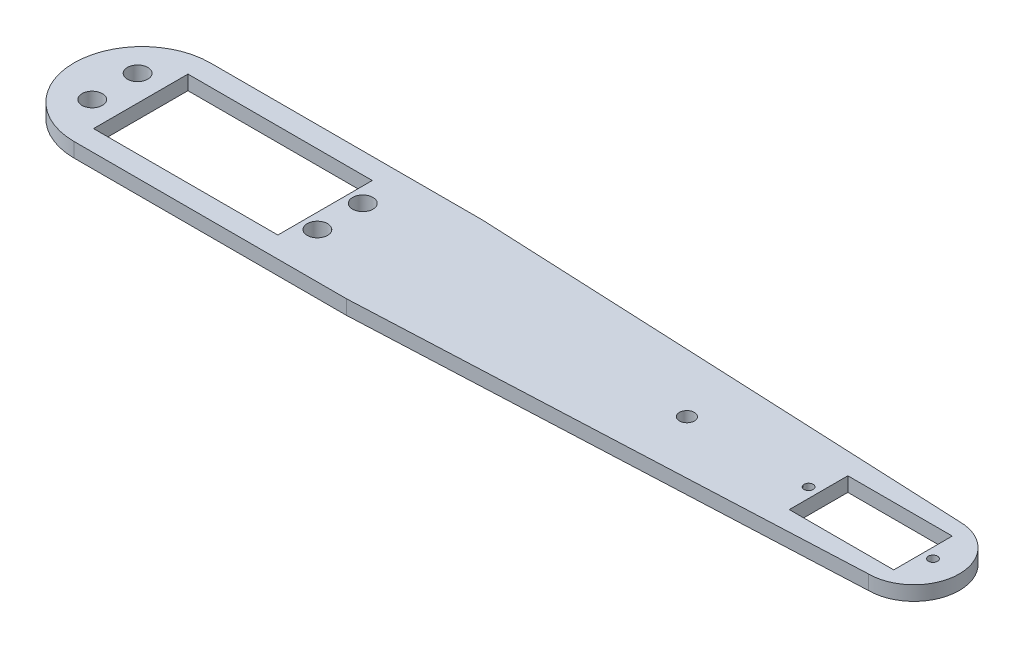
ISO-10303-21;
HEADER;
FILE_DESCRIPTION(('STEP AP214'),'2;1');
FILE_NAME('part.step','',(''),(''),'','','');
FILE_SCHEMA(('AUTOMOTIVE_DESIGN { 1 0 10303 214 1 1 1 1 }'));
ENDSEC;
DATA;
#1=APPLICATION_CONTEXT('core data for automotive mechanical design processes');
#2=APPLICATION_PROTOCOL_DEFINITION('international standard','automotive_design',2000,#1);
#3=PRODUCT_CONTEXT('',#1,'mechanical');
#4=PRODUCT('Part','Part','',(#3));
#5=PRODUCT_RELATED_PRODUCT_CATEGORY('part','',(#4));
#6=PRODUCT_DEFINITION_FORMATION('','',#4);
#7=PRODUCT_DEFINITION_CONTEXT('part definition',#1,'design');
#8=PRODUCT_DEFINITION('design','',#6,#7);
#9=PRODUCT_DEFINITION_SHAPE('','',#8);
#10=(LENGTH_UNIT() NAMED_UNIT(*) SI_UNIT(.MILLI.,.METRE.));
#11=(NAMED_UNIT(*) PLANE_ANGLE_UNIT() SI_UNIT($,.RADIAN.));
#12=(NAMED_UNIT(*) SI_UNIT($,.STERADIAN.) SOLID_ANGLE_UNIT());
#13=UNCERTAINTY_MEASURE_WITH_UNIT(LENGTH_MEASURE(1.E-05),#10,'distance_accuracy_value','');
#14=(GEOMETRIC_REPRESENTATION_CONTEXT(3) GLOBAL_UNCERTAINTY_ASSIGNED_CONTEXT((#13)) GLOBAL_UNIT_ASSIGNED_CONTEXT((#10,
#11,#12)) REPRESENTATION_CONTEXT('',''));
#15=CARTESIAN_POINT('',(0.,0.,0.));
#16=DIRECTION('',(0.,0.,1.));
#17=DIRECTION('',(1.,0.,0.));
#18=AXIS2_PLACEMENT_3D('',#15,#16,#17);
#19=CARTESIAN_POINT('',(-162.387355879804,3.175,-2.24465289077099));
#20=DIRECTION('',(0.,1.,0.));
#21=DIRECTION('',(0.,0.,1.));
#22=AXIS2_PLACEMENT_3D('',#19,#20,#21);
#23=PLANE('',#22);
#24=CARTESIAN_POINT('',(11.812644120196,3.175,-2.244652890771));
#25=DIRECTION('',(0.,1.,0.));
#26=DIRECTION('',(0.,0.,1.));
#27=AXIS2_PLACEMENT_3D('',#24,#25,#26);
#28=CIRCLE('',#27,1.);
#29=CARTESIAN_POINT('',(11.812644120196,3.175,-1.244652890771));
#30=VERTEX_POINT('',#29);
#31=EDGE_CURVE('E383',#30,#30,#28,.T.);
#32=ORIENTED_EDGE('',*,*,#31,.F.);
#33=EDGE_LOOP('',(#32));
#34=FACE_BOUND('',#33,.T.);
#35=DIRECTION('',(-1.,0.,0.));
#36=VECTOR('',#35,1.);
#37=CARTESIAN_POINT('',(-13.387355879804,3.175,-8.69465289077099));
#38=LINE('',#37,#36);
#39=CARTESIAN_POINT('',(9.61264412019603,3.175,-8.69465289077099));
#40=VERTEX_POINT('',#39);
#41=CARTESIAN_POINT('',(-13.387355879804,3.175,-8.69465289077099));
#42=VERTEX_POINT('',#41);
#43=EDGE_CURVE('E144',#40,#42,#38,.T.);
#44=ORIENTED_EDGE('',*,*,#43,.F.);
#45=DIRECTION('',(0.,0.,-1.));
#46=VECTOR('',#45,1.);
#47=CARTESIAN_POINT('',(9.61264412019603,3.175,-8.69465289077099));
#48=LINE('',#47,#46);
#49=CARTESIAN_POINT('',(9.61264412019603,3.175,4.20534710922901));
#50=VERTEX_POINT('',#49);
#51=EDGE_CURVE('E136',#50,#40,#48,.T.);
#52=ORIENTED_EDGE('',*,*,#51,.F.);
#53=DIRECTION('',(1.,0.,0.));
#54=VECTOR('',#53,1.);
#55=CARTESIAN_POINT('',(-13.387355879804,3.175,4.20534710922901));
#56=LINE('',#55,#54);
#57=CARTESIAN_POINT('',(-13.387355879804,3.175,4.20534710922901));
#58=VERTEX_POINT('',#57);
#59=EDGE_CURVE('E159',#58,#50,#56,.T.);
#60=ORIENTED_EDGE('',*,*,#59,.F.);
#61=DIRECTION('',(0.,0.,1.));
#62=VECTOR('',#61,1.);
#63=CARTESIAN_POINT('',(-13.387355879804,3.175,-8.69465289077099));
#64=LINE('',#63,#62);
#65=EDGE_CURVE('E157',#42,#58,#64,.T.);
#66=ORIENTED_EDGE('',*,*,#65,.F.);
#67=EDGE_LOOP('',(#44,#52,#60,#66));
#68=FACE_BOUND('',#67,.T.);
#69=CARTESIAN_POINT('',(-118.787355879804,3.175,2.75534710922901));
#70=DIRECTION('',(0.,1.,0.));
#71=DIRECTION('',(0.,0.,1.));
#72=AXIS2_PLACEMENT_3D('',#69,#70,#71);
#73=CIRCLE('',#72,2.25);
#74=CARTESIAN_POINT('',(-118.787355879804,3.175,5.00534710922901));
#75=VERTEX_POINT('',#74);
#76=EDGE_CURVE('E175',#75,#75,#73,.T.);
#77=ORIENTED_EDGE('',*,*,#76,.F.);
#78=EDGE_LOOP('',(#77));
#79=FACE_BOUND('',#78,.T.);
#80=CARTESIAN_POINT('',(-168.387355879804,3.175,-7.24465289077099));
#81=DIRECTION('',(0.,1.,0.));
#82=DIRECTION('',(0.,0.,1.));
#83=AXIS2_PLACEMENT_3D('',#80,#81,#82);
#84=CIRCLE('',#83,2.25000000000001);
#85=CARTESIAN_POINT('',(-168.387355879804,3.175,-4.99465289077098));
#86=VERTEX_POINT('',#85);
#87=EDGE_CURVE('E187',#86,#86,#84,.T.);
#88=ORIENTED_EDGE('',*,*,#87,.F.);
#89=EDGE_LOOP('',(#88));
#90=FACE_BOUND('',#89,.T.);
#91=DIRECTION('',(1.,0.,0.));
#92=VECTOR('',#91,1.);
#93=CARTESIAN_POINT('',(-162.692621678717,3.175,8.15534710922901));
#94=LINE('',#93,#92);
#95=CARTESIAN_POINT('',(-162.692621678717,3.175,8.15534710922901));
#96=VERTEX_POINT('',#95);
#97=CARTESIAN_POINT('',(-122.092621678717,3.175,8.15534710922901));
#98=VERTEX_POINT('',#97);
#99=EDGE_CURVE('E201',#96,#98,#94,.T.);
#100=ORIENTED_EDGE('',*,*,#99,.F.);
#101=DIRECTION('',(0.,0.,1.));
#102=VECTOR('',#101,1.);
#103=CARTESIAN_POINT('',(-162.692621678717,3.175,8.15534710922901));
#104=LINE('',#103,#102);
#105=CARTESIAN_POINT('',(-162.692621678717,3.175,-12.644652890771));
#106=VERTEX_POINT('',#105);
#107=EDGE_CURVE('E199',#106,#96,#104,.T.);
#108=ORIENTED_EDGE('',*,*,#107,.F.);
#109=DIRECTION('',(-1.,0.,0.));
#110=VECTOR('',#109,1.);
#111=CARTESIAN_POINT('',(-162.692621678717,3.175,-12.644652890771));
#112=LINE('',#111,#110);
#113=CARTESIAN_POINT('',(-122.092621678717,3.175,-12.644652890771));
#114=VERTEX_POINT('',#113);
#115=EDGE_CURVE('E207',#114,#106,#112,.T.);
#116=ORIENTED_EDGE('',*,*,#115,.F.);
#117=DIRECTION('',(0.,0.,-1.));
#118=VECTOR('',#117,1.);
#119=CARTESIAN_POINT('',(-122.092621678717,3.175,8.15534710922901));
#120=LINE('',#119,#118);
#121=EDGE_CURVE('E204',#98,#114,#120,.T.);
#122=ORIENTED_EDGE('',*,*,#121,.F.);
#123=EDGE_LOOP('',(#100,#108,#116,#122));
#124=FACE_BOUND('',#123,.T.);
#125=CARTESIAN_POINT('',(-162.387355879804,3.175,-2.24465289077099));
#126=DIRECTION('',(0.,1.,0.));
#127=DIRECTION('',(0.,0.,1.));
#128=AXIS2_PLACEMENT_3D('',#125,#126,#127);
#129=CIRCLE('',#128,15.);
#130=CARTESIAN_POINT('',(-162.387355879804,3.175,-17.244652890771));
#131=VERTEX_POINT('',#130);
#132=CARTESIAN_POINT('',(-162.387355879804,3.175,12.755347109229));
#133=VERTEX_POINT('',#132);
#134=EDGE_CURVE('E230',#131,#133,#129,.T.);
#135=ORIENTED_EDGE('',*,*,#134,.T.);
#136=DIRECTION('',(1.,0.,0.));
#137=VECTOR('',#136,1.);
#138=CARTESIAN_POINT('',(-162.387355879804,3.175,12.755347109229));
#139=LINE('',#138,#137);
#140=CARTESIAN_POINT('',(-102.387355879804,3.175,12.755347109229));
#141=VERTEX_POINT('',#140);
#142=EDGE_CURVE('E233',#133,#141,#139,.T.);
#143=ORIENTED_EDGE('',*,*,#142,.T.);
#144=DIRECTION('',(0.9989685402103,0.,-0.04540766091865));
#145=VECTOR('',#144,1.);
#146=CARTESIAN_POINT('',(-102.387355879804,3.175,12.755347109229));
#147=LINE('',#146,#145);
#148=CARTESIAN_POINT('',(7.61264412019603,3.175,7.75534710922901));
#149=VERTEX_POINT('',#148);
#150=EDGE_CURVE('E236',#141,#149,#147,.T.);
#151=ORIENTED_EDGE('',*,*,#150,.T.);
#152=CARTESIAN_POINT('',(7.61264412019603,3.175,-2.24465289077099));
#153=DIRECTION('',(0.,1.,0.));
#154=DIRECTION('',(0.,0.,1.));
#155=AXIS2_PLACEMENT_3D('',#152,#153,#154);
#156=CIRCLE('',#155,10.);
#157=CARTESIAN_POINT('',(7.61264412019603,3.175,-12.244652890771));
#158=VERTEX_POINT('',#157);
#159=EDGE_CURVE('E238',#149,#158,#156,.T.);
#160=ORIENTED_EDGE('',*,*,#159,.T.);
#161=DIRECTION('',(-0.998968540210299,0.,-0.04540766091865));
#162=VECTOR('',#161,1.);
#163=CARTESIAN_POINT('',(-102.387355879804,3.175,-17.244652890771));
#164=LINE('',#163,#162);
#165=CARTESIAN_POINT('',(-102.387355879804,3.175,-17.244652890771));
#166=VERTEX_POINT('',#165);
#167=EDGE_CURVE('E240',#158,#166,#164,.T.);
#168=ORIENTED_EDGE('',*,*,#167,.T.);
#169=DIRECTION('',(-1.,0.,0.));
#170=VECTOR('',#169,1.);
#171=CARTESIAN_POINT('',(-162.387355879804,3.175,-17.244652890771));
#172=LINE('',#171,#170);
#173=EDGE_CURVE('E242',#166,#131,#172,.T.);
#174=ORIENTED_EDGE('',*,*,#173,.T.);
#175=EDGE_LOOP('',(#135,#143,#151,#160,#168,#174));
#176=FACE_BOUND('',#175,.T.);
#177=CARTESIAN_POINT('',(-168.387355879804,3.175,2.75534710922901));
#178=DIRECTION('',(0.,1.,0.));
#179=DIRECTION('',(0.,0.,1.));
#180=AXIS2_PLACEMENT_3D('',#177,#178,#179);
#181=CIRCLE('',#180,2.25000000000001);
#182=CARTESIAN_POINT('',(-168.387355879804,3.175,5.00534710922902));
#183=VERTEX_POINT('',#182);
#184=EDGE_CURVE('E193',#183,#183,#181,.T.);
#185=ORIENTED_EDGE('',*,*,#184,.F.);
#186=EDGE_LOOP('',(#185));
#187=FACE_BOUND('',#186,.T.);
#188=CARTESIAN_POINT('',(-118.787355879804,3.175,-7.24465289077099));
#189=DIRECTION('',(0.,1.,0.));
#190=DIRECTION('',(0.,0.,1.));
#191=AXIS2_PLACEMENT_3D('',#188,#189,#190);
#192=CIRCLE('',#191,2.25);
#193=CARTESIAN_POINT('',(-118.787355879804,3.175,-4.994652890771));
#194=VERTEX_POINT('',#193);
#195=EDGE_CURVE('E181',#194,#194,#192,.T.);
#196=ORIENTED_EDGE('',*,*,#195,.F.);
#197=EDGE_LOOP('',(#196));
#198=FACE_BOUND('',#197,.T.);
#199=CARTESIAN_POINT('',(-15.587355879804,3.175,-2.24465289077099));
#200=DIRECTION('',(0.,1.,0.));
#201=DIRECTION('',(0.,0.,1.));
#202=AXIS2_PLACEMENT_3D('',#199,#200,#201);
#203=CIRCLE('',#202,1.);
#204=CARTESIAN_POINT('',(-15.587355879804,3.175,-1.24465289077099));
#205=VERTEX_POINT('',#204);
#206=EDGE_CURVE('E165',#205,#205,#203,.T.);
#207=ORIENTED_EDGE('',*,*,#206,.F.);
#208=EDGE_LOOP('',(#207));
#209=FACE_BOUND('',#208,.T.);
#210=CARTESIAN_POINT('',(-42.387355879804,3.175,-2.24465289077099));
#211=DIRECTION('',(0.,1.,0.));
#212=DIRECTION('',(0.,0.,1.));
#213=AXIS2_PLACEMENT_3D('',#210,#211,#212);
#214=CIRCLE('',#213,1.65);
#215=CARTESIAN_POINT('',(-42.387355879804,3.175,-0.594652890770989));
#216=VERTEX_POINT('',#215);
#217=EDGE_CURVE('E374',#216,#216,#214,.T.);
#218=ORIENTED_EDGE('',*,*,#217,.F.);
#219=EDGE_LOOP('',(#218));
#220=FACE_BOUND('',#219,.T.);
#221=ADVANCED_FACE('F35',(#34,#68,#79,#90,#124,#176,#187,#198,#209,#220),#23,.T.);
#222=CARTESIAN_POINT('',(-162.387355879804,0.,-2.24465289077099));
#223=DIRECTION('',(0.,1.,0.));
#224=DIRECTION('',(0.,0.,1.));
#225=AXIS2_PLACEMENT_3D('',#222,#223,#224);
#226=PLANE('',#225);
#227=CARTESIAN_POINT('',(-118.787355879804,0.,2.75534710922901));
#228=DIRECTION('',(0.,1.,0.));
#229=DIRECTION('',(0.,0.,1.));
#230=AXIS2_PLACEMENT_3D('',#227,#228,#229);
#231=CIRCLE('',#230,2.25);
#232=CARTESIAN_POINT('',(-118.787355879804,0.,5.00534710922901));
#233=VERTEX_POINT('',#232);
#234=EDGE_CURVE('E152',#233,#233,#231,.T.);
#235=ORIENTED_EDGE('',*,*,#234,.T.);
#236=EDGE_LOOP('',(#235));
#237=FACE_BOUND('',#236,.T.);
#238=CARTESIAN_POINT('',(-118.787355879804,0.,-7.24465289077099));
#239=DIRECTION('',(0.,1.,0.));
#240=DIRECTION('',(0.,0.,1.));
#241=AXIS2_PLACEMENT_3D('',#238,#239,#240);
#242=CIRCLE('',#241,2.25);
#243=CARTESIAN_POINT('',(-118.787355879804,0.,-4.994652890771));
#244=VERTEX_POINT('',#243);
#245=EDGE_CURVE('E178',#244,#244,#242,.T.);
#246=ORIENTED_EDGE('',*,*,#245,.T.);
#247=EDGE_LOOP('',(#246));
#248=FACE_BOUND('',#247,.T.);
#249=CARTESIAN_POINT('',(-168.387355879804,0.,-7.24465289077099));
#250=DIRECTION('',(0.,1.,0.));
#251=DIRECTION('',(0.,0.,1.));
#252=AXIS2_PLACEMENT_3D('',#249,#250,#251);
#253=CIRCLE('',#252,2.25000000000001);
#254=CARTESIAN_POINT('',(-168.387355879804,0.,-4.99465289077098));
#255=VERTEX_POINT('',#254);
#256=EDGE_CURVE('E184',#255,#255,#253,.T.);
#257=ORIENTED_EDGE('',*,*,#256,.T.);
#258=EDGE_LOOP('',(#257));
#259=FACE_BOUND('',#258,.T.);
#260=CARTESIAN_POINT('',(-168.387355879804,0.,2.75534710922901));
#261=DIRECTION('',(0.,1.,0.));
#262=DIRECTION('',(0.,0.,1.));
#263=AXIS2_PLACEMENT_3D('',#260,#261,#262);
#264=CIRCLE('',#263,2.25000000000001);
#265=CARTESIAN_POINT('',(-168.387355879804,0.,5.00534710922902));
#266=VERTEX_POINT('',#265);
#267=EDGE_CURVE('E190',#266,#266,#264,.T.);
#268=ORIENTED_EDGE('',*,*,#267,.T.);
#269=EDGE_LOOP('',(#268));
#270=FACE_BOUND('',#269,.T.);
#271=DIRECTION('',(0.,0.,1.));
#272=VECTOR('',#271,1.);
#273=CARTESIAN_POINT('',(-162.692621678717,0.,8.15534710922901));
#274=LINE('',#273,#272);
#275=CARTESIAN_POINT('',(-162.692621678717,0.,-12.644652890771));
#276=VERTEX_POINT('',#275);
#277=CARTESIAN_POINT('',(-162.692621678717,0.,8.15534710922901));
#278=VERTEX_POINT('',#277);
#279=EDGE_CURVE('E196',#276,#278,#274,.T.);
#280=ORIENTED_EDGE('',*,*,#279,.T.);
#281=DIRECTION('',(1.,0.,0.));
#282=VECTOR('',#281,1.);
#283=CARTESIAN_POINT('',(-162.692621678717,0.,8.15534710922901));
#284=LINE('',#283,#282);
#285=CARTESIAN_POINT('',(-122.092621678717,0.,8.15534710922901));
#286=VERTEX_POINT('',#285);
#287=EDGE_CURVE('E212',#278,#286,#284,.T.);
#288=ORIENTED_EDGE('',*,*,#287,.T.);
#289=DIRECTION('',(0.,0.,-1.));
#290=VECTOR('',#289,1.);
#291=CARTESIAN_POINT('',(-122.092621678717,0.,8.15534710922901));
#292=LINE('',#291,#290);
#293=CARTESIAN_POINT('',(-122.092621678717,0.,-12.644652890771));
#294=VERTEX_POINT('',#293);
#295=EDGE_CURVE('E215',#286,#294,#292,.T.);
#296=ORIENTED_EDGE('',*,*,#295,.T.);
#297=DIRECTION('',(-1.,0.,0.));
#298=VECTOR('',#297,1.);
#299=CARTESIAN_POINT('',(-162.692621678717,0.,-12.644652890771));
#300=LINE('',#299,#298);
#301=EDGE_CURVE('E202',#294,#276,#300,.T.);
#302=ORIENTED_EDGE('',*,*,#301,.T.);
#303=EDGE_LOOP('',(#280,#288,#296,#302));
#304=FACE_BOUND('',#303,.T.);
#305=CARTESIAN_POINT('',(-162.387355879804,0.,-2.24465289077099));
#306=DIRECTION('',(0.,1.,0.));
#307=DIRECTION('',(0.,0.,1.));
#308=AXIS2_PLACEMENT_3D('',#305,#306,#307);
#309=CIRCLE('',#308,15.);
#310=CARTESIAN_POINT('',(-162.387355879804,0.,-17.244652890771));
#311=VERTEX_POINT('',#310);
#312=CARTESIAN_POINT('',(-162.387355879804,0.,12.755347109229));
#313=VERTEX_POINT('',#312);
#314=EDGE_CURVE('E229',#311,#313,#309,.T.);
#315=ORIENTED_EDGE('',*,*,#314,.F.);
#316=DIRECTION('',(-1.,0.,0.));
#317=VECTOR('',#316,1.);
#318=CARTESIAN_POINT('',(-162.387355879804,0.,-17.244652890771));
#319=LINE('',#318,#317);
#320=CARTESIAN_POINT('',(-102.387355879804,0.,-17.244652890771));
#321=VERTEX_POINT('',#320);
#322=EDGE_CURVE('E234',#321,#311,#319,.T.);
#323=ORIENTED_EDGE('',*,*,#322,.F.);
#324=DIRECTION('',(-0.998968540210299,0.,-0.04540766091865));
#325=VECTOR('',#324,1.);
#326=CARTESIAN_POINT('',(-102.387355879804,0.,-17.244652890771));
#327=LINE('',#326,#325);
#328=CARTESIAN_POINT('',(7.61264412019603,0.,-12.244652890771));
#329=VERTEX_POINT('',#328);
#330=EDGE_CURVE('E253',#329,#321,#327,.T.);
#331=ORIENTED_EDGE('',*,*,#330,.F.);
#332=CARTESIAN_POINT('',(7.61264412019603,0.,-2.24465289077099));
#333=DIRECTION('',(0.,1.,0.));
#334=DIRECTION('',(0.,0.,1.));
#335=AXIS2_PLACEMENT_3D('',#332,#333,#334);
#336=CIRCLE('',#335,10.);
#337=CARTESIAN_POINT('',(7.61264412019603,0.,7.75534710922901));
#338=VERTEX_POINT('',#337);
#339=EDGE_CURVE('E251',#338,#329,#336,.T.);
#340=ORIENTED_EDGE('',*,*,#339,.F.);
#341=DIRECTION('',(0.9989685402103,0.,-0.04540766091865));
#342=VECTOR('',#341,1.);
#343=CARTESIAN_POINT('',(-102.387355879804,0.,12.755347109229));
#344=LINE('',#343,#342);
#345=CARTESIAN_POINT('',(-102.387355879804,0.,12.755347109229));
#346=VERTEX_POINT('',#345);
#347=EDGE_CURVE('E249',#346,#338,#344,.T.);
#348=ORIENTED_EDGE('',*,*,#347,.F.);
#349=DIRECTION('',(1.,0.,0.));
#350=VECTOR('',#349,1.);
#351=CARTESIAN_POINT('',(-162.387355879804,0.,12.755347109229));
#352=LINE('',#351,#350);
#353=EDGE_CURVE('E247',#313,#346,#352,.T.);
#354=ORIENTED_EDGE('',*,*,#353,.F.);
#355=EDGE_LOOP('',(#315,#323,#331,#340,#348,#354));
#356=FACE_BOUND('',#355,.T.);
#357=DIRECTION('',(0.,0.,-1.));
#358=VECTOR('',#357,1.);
#359=CARTESIAN_POINT('',(9.61264412019603,0.,-8.69465289077099));
#360=LINE('',#359,#358);
#361=CARTESIAN_POINT('',(9.61264412019602,0.,4.20534710922901));
#362=VERTEX_POINT('',#361);
#363=CARTESIAN_POINT('',(9.61264412019603,0.,-8.69465289077099));
#364=VERTEX_POINT('',#363);
#365=EDGE_CURVE('E58',#362,#364,#360,.T.);
#366=ORIENTED_EDGE('',*,*,#365,.T.);
#367=DIRECTION('',(-1.,0.,0.));
#368=VECTOR('',#367,1.);
#369=CARTESIAN_POINT('',(-13.387355879804,0.,-8.69465289077099));
#370=LINE('',#369,#368);
#371=CARTESIAN_POINT('',(-13.387355879804,0.,-8.69465289077099));
#372=VERTEX_POINT('',#371);
#373=EDGE_CURVE('E151',#364,#372,#370,.T.);
#374=ORIENTED_EDGE('',*,*,#373,.T.);
#375=DIRECTION('',(0.,0.,1.));
#376=VECTOR('',#375,1.);
#377=CARTESIAN_POINT('',(-13.387355879804,0.,-8.69465289077099));
#378=LINE('',#377,#376);
#379=CARTESIAN_POINT('',(-13.387355879804,0.,4.20534710922901));
#380=VERTEX_POINT('',#379);
#381=EDGE_CURVE('E167',#372,#380,#378,.T.);
#382=ORIENTED_EDGE('',*,*,#381,.T.);
#383=DIRECTION('',(1.,0.,0.));
#384=VECTOR('',#383,1.);
#385=CARTESIAN_POINT('',(-13.387355879804,0.,4.20534710922901));
#386=LINE('',#385,#384);
#387=EDGE_CURVE('E145',#380,#362,#386,.T.);
#388=ORIENTED_EDGE('',*,*,#387,.T.);
#389=EDGE_LOOP('',(#366,#374,#382,#388));
#390=FACE_BOUND('',#389,.T.);
#391=CARTESIAN_POINT('',(-15.587355879804,0.,-2.24465289077099));
#392=DIRECTION('',(0.,1.,0.));
#393=DIRECTION('',(0.,0.,1.));
#394=AXIS2_PLACEMENT_3D('',#391,#392,#393);
#395=CIRCLE('',#394,1.);
#396=CARTESIAN_POINT('',(-15.587355879804,0.,-1.24465289077099));
#397=VERTEX_POINT('',#396);
#398=EDGE_CURVE('E386',#397,#397,#395,.T.);
#399=ORIENTED_EDGE('',*,*,#398,.T.);
#400=EDGE_LOOP('',(#399));
#401=FACE_BOUND('',#400,.T.);
#402=CARTESIAN_POINT('',(11.812644120196,0.,-2.244652890771));
#403=DIRECTION('',(0.,1.,0.));
#404=DIRECTION('',(0.,0.,1.));
#405=AXIS2_PLACEMENT_3D('',#402,#403,#404);
#406=CIRCLE('',#405,1.);
#407=CARTESIAN_POINT('',(11.812644120196,0.,-1.244652890771));
#408=VERTEX_POINT('',#407);
#409=EDGE_CURVE('E380',#408,#408,#406,.T.);
#410=ORIENTED_EDGE('',*,*,#409,.T.);
#411=EDGE_LOOP('',(#410));
#412=FACE_BOUND('',#411,.T.);
#413=CARTESIAN_POINT('',(-42.387355879804,0.,-2.24465289077099));
#414=DIRECTION('',(0.,1.,0.));
#415=DIRECTION('',(0.,0.,1.));
#416=AXIS2_PLACEMENT_3D('',#413,#414,#415);
#417=CIRCLE('',#416,1.65);
#418=CARTESIAN_POINT('',(-42.387355879804,0.,-0.594652890770989));
#419=VERTEX_POINT('',#418);
#420=EDGE_CURVE('E377',#419,#419,#417,.T.);
#421=ORIENTED_EDGE('',*,*,#420,.T.);
#422=EDGE_LOOP('',(#421));
#423=FACE_BOUND('',#422,.T.);
#424=ADVANCED_FACE('F277',(#237,#248,#259,#270,#304,#356,#390,#401,#412,#423),#226,.F.);
#425=CARTESIAN_POINT('',(-162.387355879804,3.175,-2.24465289077099));
#426=DIRECTION('',(0.,-1.,0.));
#427=DIRECTION('',(0.,0.,-1.));
#428=AXIS2_PLACEMENT_3D('',#425,#426,#427);
#429=CYLINDRICAL_SURFACE('',#428,15.);
#430=ORIENTED_EDGE('',*,*,#314,.T.);
#431=DIRECTION('',(0.,-1.,0.));
#432=VECTOR('',#431,1.);
#433=CARTESIAN_POINT('',(-162.387355879804,3.175,12.755347109229));
#434=LINE('',#433,#432);
#435=EDGE_CURVE('E11',#133,#313,#434,.T.);
#436=ORIENTED_EDGE('',*,*,#435,.F.);
#437=ORIENTED_EDGE('',*,*,#134,.F.);
#438=DIRECTION('',(0.,-1.,0.));
#439=VECTOR('',#438,1.);
#440=CARTESIAN_POINT('',(-162.387355879804,3.175,-17.244652890771));
#441=LINE('',#440,#439);
#442=EDGE_CURVE('E244',#131,#311,#441,.T.);
#443=ORIENTED_EDGE('',*,*,#442,.T.);
#444=EDGE_LOOP('',(#430,#436,#437,#443));
#445=FACE_BOUND('',#444,.T.);
#446=ADVANCED_FACE('F37',(#445),#429,.T.);
#447=CARTESIAN_POINT('',(-162.387355879804,3.175,12.755347109229));
#448=DIRECTION('',(0.,0.,-1.));
#449=DIRECTION('',(-1.,0.,0.));
#450=AXIS2_PLACEMENT_3D('',#447,#448,#449);
#451=PLANE('',#450);
#452=ORIENTED_EDGE('',*,*,#353,.T.);
#453=DIRECTION('',(0.,-1.,0.));
#454=VECTOR('',#453,1.);
#455=CARTESIAN_POINT('',(-102.387355879804,3.175,12.755347109229));
#456=LINE('',#455,#454);
#457=EDGE_CURVE('E43',#141,#346,#456,.T.);
#458=ORIENTED_EDGE('',*,*,#457,.F.);
#459=ORIENTED_EDGE('',*,*,#142,.F.);
#460=ORIENTED_EDGE('',*,*,#435,.T.);
#461=EDGE_LOOP('',(#452,#458,#459,#460));
#462=FACE_BOUND('',#461,.T.);
#463=ADVANCED_FACE('F295',(#462),#451,.F.);
#464=CARTESIAN_POINT('',(-102.387355879804,3.175,12.755347109229));
#465=DIRECTION('',(-0.04540766091865,0.,-0.9989685402103));
#466=DIRECTION('',(-0.9989685402103,0.,0.04540766091865));
#467=AXIS2_PLACEMENT_3D('',#464,#465,#466);
#468=PLANE('',#467);
#469=ORIENTED_EDGE('',*,*,#347,.T.);
#470=DIRECTION('',(0.,-1.,0.));
#471=VECTOR('',#470,1.);
#472=CARTESIAN_POINT('',(7.61264412019603,3.175,7.75534710922901));
#473=LINE('',#472,#471);
#474=EDGE_CURVE('E264',#149,#338,#473,.T.);
#475=ORIENTED_EDGE('',*,*,#474,.F.);
#476=ORIENTED_EDGE('',*,*,#150,.F.);
#477=ORIENTED_EDGE('',*,*,#457,.T.);
#478=EDGE_LOOP('',(#469,#475,#476,#477));
#479=FACE_BOUND('',#478,.T.);
#480=ADVANCED_FACE('F271',(#479),#468,.F.);
#481=CARTESIAN_POINT('',(7.61264412019603,3.175,-2.24465289077099));
#482=DIRECTION('',(0.,-1.,0.));
#483=DIRECTION('',(0.,0.,-1.));
#484=AXIS2_PLACEMENT_3D('',#481,#482,#483);
#485=CYLINDRICAL_SURFACE('',#484,10.);
#486=ORIENTED_EDGE('',*,*,#339,.T.);
#487=DIRECTION('',(0.,-1.,0.));
#488=VECTOR('',#487,1.);
#489=CARTESIAN_POINT('',(7.61264412019603,3.175,-12.244652890771));
#490=LINE('',#489,#488);
#491=EDGE_CURVE('E261',#158,#329,#490,.T.);
#492=ORIENTED_EDGE('',*,*,#491,.F.);
#493=ORIENTED_EDGE('',*,*,#159,.F.);
#494=ORIENTED_EDGE('',*,*,#474,.T.);
#495=EDGE_LOOP('',(#486,#492,#493,#494));
#496=FACE_BOUND('',#495,.T.);
#497=ADVANCED_FACE('F283',(#496),#485,.T.);
#498=CARTESIAN_POINT('',(-102.387355879804,3.175,-17.244652890771));
#499=DIRECTION('',(-0.04540766091865,0.,0.9989685402103));
#500=DIRECTION('',(0.9989685402103,0.,0.04540766091865));
#501=AXIS2_PLACEMENT_3D('',#498,#499,#500);
#502=PLANE('',#501);
#503=ORIENTED_EDGE('',*,*,#330,.T.);
#504=DIRECTION('',(0.,-1.,0.));
#505=VECTOR('',#504,1.);
#506=CARTESIAN_POINT('',(-102.387355879804,3.175,-17.244652890771));
#507=LINE('',#506,#505);
#508=EDGE_CURVE('E258',#166,#321,#507,.T.);
#509=ORIENTED_EDGE('',*,*,#508,.F.);
#510=ORIENTED_EDGE('',*,*,#167,.F.);
#511=ORIENTED_EDGE('',*,*,#491,.T.);
#512=EDGE_LOOP('',(#503,#509,#510,#511));
#513=FACE_BOUND('',#512,.T.);
#514=ADVANCED_FACE('F287',(#513),#502,.F.);
#515=CARTESIAN_POINT('',(-162.387355879804,3.175,-17.244652890771));
#516=DIRECTION('',(0.,0.,1.));
#517=DIRECTION('',(1.,0.,0.));
#518=AXIS2_PLACEMENT_3D('',#515,#516,#517);
#519=PLANE('',#518);
#520=ORIENTED_EDGE('',*,*,#322,.T.);
#521=ORIENTED_EDGE('',*,*,#442,.F.);
#522=ORIENTED_EDGE('',*,*,#173,.F.);
#523=ORIENTED_EDGE('',*,*,#508,.T.);
#524=EDGE_LOOP('',(#520,#521,#522,#523));
#525=FACE_BOUND('',#524,.T.);
#526=ADVANCED_FACE('F298',(#525),#519,.F.);
#527=CARTESIAN_POINT('',(-162.692621678717,3.175,8.15534710922901));
#528=DIRECTION('',(1.,0.,0.));
#529=DIRECTION('',(0.,0.,-1.));
#530=AXIS2_PLACEMENT_3D('',#527,#528,#529);
#531=PLANE('',#530);
#532=ORIENTED_EDGE('',*,*,#279,.F.);
#533=DIRECTION('',(0.,-1.,0.));
#534=VECTOR('',#533,1.);
#535=CARTESIAN_POINT('',(-162.692621678717,3.175,-12.644652890771));
#536=LINE('',#535,#534);
#537=EDGE_CURVE('E209',#106,#276,#536,.T.);
#538=ORIENTED_EDGE('',*,*,#537,.F.);
#539=ORIENTED_EDGE('',*,*,#107,.T.);
#540=DIRECTION('',(0.,-1.,0.));
#541=VECTOR('',#540,1.);
#542=CARTESIAN_POINT('',(-162.692621678717,3.175,8.15534710922901));
#543=LINE('',#542,#541);
#544=EDGE_CURVE('E226',#96,#278,#543,.T.);
#545=ORIENTED_EDGE('',*,*,#544,.T.);
#546=EDGE_LOOP('',(#532,#538,#539,#545));
#547=FACE_BOUND('',#546,.T.);
#548=ADVANCED_FACE('F300',(#547),#531,.T.);
#549=CARTESIAN_POINT('',(-162.692621678717,3.175,8.15534710922901));
#550=DIRECTION('',(0.,0.,-1.));
#551=DIRECTION('',(-1.,0.,0.));
#552=AXIS2_PLACEMENT_3D('',#549,#550,#551);
#553=PLANE('',#552);
#554=ORIENTED_EDGE('',*,*,#287,.F.);
#555=ORIENTED_EDGE('',*,*,#544,.F.);
#556=ORIENTED_EDGE('',*,*,#99,.T.);
#557=DIRECTION('',(0.,-1.,0.));
#558=VECTOR('',#557,1.);
#559=CARTESIAN_POINT('',(-122.092621678717,3.175,8.15534710922901));
#560=LINE('',#559,#558);
#561=EDGE_CURVE('E224',#98,#286,#560,.T.);
#562=ORIENTED_EDGE('',*,*,#561,.T.);
#563=EDGE_LOOP('',(#554,#555,#556,#562));
#564=FACE_BOUND('',#563,.T.);
#565=ADVANCED_FACE('F306',(#564),#553,.T.);
#566=CARTESIAN_POINT('',(-122.092621678717,3.175,8.15534710922901));
#567=DIRECTION('',(-1.,0.,0.));
#568=DIRECTION('',(0.,0.,1.));
#569=AXIS2_PLACEMENT_3D('',#566,#567,#568);
#570=PLANE('',#569);
#571=ORIENTED_EDGE('',*,*,#295,.F.);
#572=ORIENTED_EDGE('',*,*,#561,.F.);
#573=ORIENTED_EDGE('',*,*,#121,.T.);
#574=DIRECTION('',(0.,-1.,0.));
#575=VECTOR('',#574,1.);
#576=CARTESIAN_POINT('',(-122.092621678717,3.175,-12.644652890771));
#577=LINE('',#576,#575);
#578=EDGE_CURVE('E222',#114,#294,#577,.T.);
#579=ORIENTED_EDGE('',*,*,#578,.T.);
#580=EDGE_LOOP('',(#571,#572,#573,#579));
#581=FACE_BOUND('',#580,.T.);
#582=ADVANCED_FACE('F322',(#581),#570,.T.);
#583=CARTESIAN_POINT('',(-162.692621678717,3.175,-12.644652890771));
#584=DIRECTION('',(0.,0.,1.));
#585=DIRECTION('',(1.,0.,0.));
#586=AXIS2_PLACEMENT_3D('',#583,#584,#585);
#587=PLANE('',#586);
#588=ORIENTED_EDGE('',*,*,#301,.F.);
#589=ORIENTED_EDGE('',*,*,#578,.F.);
#590=ORIENTED_EDGE('',*,*,#115,.T.);
#591=ORIENTED_EDGE('',*,*,#537,.T.);
#592=EDGE_LOOP('',(#588,#589,#590,#591));
#593=FACE_BOUND('',#592,.T.);
#594=ADVANCED_FACE('F326',(#593),#587,.T.);
#595=CARTESIAN_POINT('',(-168.387355879804,3.175,2.75534710922901));
#596=DIRECTION('',(0.,-1.,0.));
#597=DIRECTION('',(0.,0.,-1.));
#598=AXIS2_PLACEMENT_3D('',#595,#596,#597);
#599=CYLINDRICAL_SURFACE('',#598,2.25000000000001);
#600=ORIENTED_EDGE('',*,*,#184,.T.);
#601=EDGE_LOOP('',(#600));
#602=FACE_BOUND('',#601,.T.);
#603=ORIENTED_EDGE('',*,*,#267,.F.);
#604=EDGE_LOOP('',(#603));
#605=FACE_BOUND('',#604,.T.);
#606=ADVANCED_FACE('F330',(#602,#605),#599,.F.);
#607=CARTESIAN_POINT('',(-168.387355879804,3.175,-7.24465289077099));
#608=DIRECTION('',(0.,-1.,0.));
#609=DIRECTION('',(0.,0.,-1.));
#610=AXIS2_PLACEMENT_3D('',#607,#608,#609);
#611=CYLINDRICAL_SURFACE('',#610,2.25000000000001);
#612=ORIENTED_EDGE('',*,*,#87,.T.);
#613=EDGE_LOOP('',(#612));
#614=FACE_BOUND('',#613,.T.);
#615=ORIENTED_EDGE('',*,*,#256,.F.);
#616=EDGE_LOOP('',(#615));
#617=FACE_BOUND('',#616,.T.);
#618=ADVANCED_FACE('F334',(#614,#617),#611,.F.);
#619=CARTESIAN_POINT('',(-118.787355879804,3.175,-7.24465289077099));
#620=DIRECTION('',(0.,-1.,0.));
#621=DIRECTION('',(0.,0.,-1.));
#622=AXIS2_PLACEMENT_3D('',#619,#620,#621);
#623=CYLINDRICAL_SURFACE('',#622,2.25);
#624=ORIENTED_EDGE('',*,*,#195,.T.);
#625=EDGE_LOOP('',(#624));
#626=FACE_BOUND('',#625,.T.);
#627=ORIENTED_EDGE('',*,*,#245,.F.);
#628=EDGE_LOOP('',(#627));
#629=FACE_BOUND('',#628,.T.);
#630=ADVANCED_FACE('F338',(#626,#629),#623,.F.);
#631=CARTESIAN_POINT('',(-118.787355879804,3.175,2.75534710922901));
#632=DIRECTION('',(0.,-1.,0.));
#633=DIRECTION('',(0.,0.,-1.));
#634=AXIS2_PLACEMENT_3D('',#631,#632,#633);
#635=CYLINDRICAL_SURFACE('',#634,2.25);
#636=ORIENTED_EDGE('',*,*,#76,.T.);
#637=EDGE_LOOP('',(#636));
#638=FACE_BOUND('',#637,.T.);
#639=ORIENTED_EDGE('',*,*,#234,.F.);
#640=EDGE_LOOP('',(#639));
#641=FACE_BOUND('',#640,.T.);
#642=ADVANCED_FACE('F342',(#638,#641),#635,.F.);
#643=CARTESIAN_POINT('',(9.61264412019603,3.175,-8.69465289077099));
#644=DIRECTION('',(-1.,0.,0.));
#645=DIRECTION('',(0.,0.,1.));
#646=AXIS2_PLACEMENT_3D('',#643,#644,#645);
#647=PLANE('',#646);
#648=ORIENTED_EDGE('',*,*,#365,.F.);
#649=DIRECTION('',(0.,-1.,0.));
#650=VECTOR('',#649,1.);
#651=CARTESIAN_POINT('',(9.61264412019603,3.175,4.20534710922901));
#652=LINE('',#651,#650);
#653=EDGE_CURVE('E140',#50,#362,#652,.T.);
#654=ORIENTED_EDGE('',*,*,#653,.F.);
#655=ORIENTED_EDGE('',*,*,#51,.T.);
#656=DIRECTION('',(0.,-1.,0.));
#657=VECTOR('',#656,1.);
#658=CARTESIAN_POINT('',(9.61264412019603,3.175,-8.69465289077099));
#659=LINE('',#658,#657);
#660=EDGE_CURVE('E139',#40,#364,#659,.T.);
#661=ORIENTED_EDGE('',*,*,#660,.T.);
#662=EDGE_LOOP('',(#648,#654,#655,#661));
#663=FACE_BOUND('',#662,.T.);
#664=ADVANCED_FACE('F138',(#663),#647,.T.);
#665=CARTESIAN_POINT('',(-13.387355879804,3.175,-8.69465289077099));
#666=DIRECTION('',(0.,0.,1.));
#667=DIRECTION('',(1.,0.,0.));
#668=AXIS2_PLACEMENT_3D('',#665,#666,#667);
#669=PLANE('',#668);
#670=ORIENTED_EDGE('',*,*,#373,.F.);
#671=ORIENTED_EDGE('',*,*,#660,.F.);
#672=ORIENTED_EDGE('',*,*,#43,.T.);
#673=DIRECTION('',(0.,-1.,0.));
#674=VECTOR('',#673,1.);
#675=CARTESIAN_POINT('',(-13.387355879804,3.175,-8.69465289077099));
#676=LINE('',#675,#674);
#677=EDGE_CURVE('E153',#42,#372,#676,.T.);
#678=ORIENTED_EDGE('',*,*,#677,.T.);
#679=EDGE_LOOP('',(#670,#671,#672,#678));
#680=FACE_BOUND('',#679,.T.);
#681=ADVANCED_FACE('F148',(#680),#669,.T.);
#682=CARTESIAN_POINT('',(-13.387355879804,3.175,-8.69465289077099));
#683=DIRECTION('',(1.,0.,0.));
#684=DIRECTION('',(0.,0.,-1.));
#685=AXIS2_PLACEMENT_3D('',#682,#683,#684);
#686=PLANE('',#685);
#687=ORIENTED_EDGE('',*,*,#381,.F.);
#688=ORIENTED_EDGE('',*,*,#677,.F.);
#689=ORIENTED_EDGE('',*,*,#65,.T.);
#690=DIRECTION('',(0.,-1.,0.));
#691=VECTOR('',#690,1.);
#692=CARTESIAN_POINT('',(-13.387355879804,3.175,4.20534710922901));
#693=LINE('',#692,#691);
#694=EDGE_CURVE('E50',#58,#380,#693,.T.);
#695=ORIENTED_EDGE('',*,*,#694,.T.);
#696=EDGE_LOOP('',(#687,#688,#689,#695));
#697=FACE_BOUND('',#696,.T.);
#698=ADVANCED_FACE('F351',(#697),#686,.T.);
#699=CARTESIAN_POINT('',(-13.387355879804,3.175,4.20534710922901));
#700=DIRECTION('',(0.,0.,-1.));
#701=DIRECTION('',(-1.,0.,0.));
#702=AXIS2_PLACEMENT_3D('',#699,#700,#701);
#703=PLANE('',#702);
#704=ORIENTED_EDGE('',*,*,#387,.F.);
#705=ORIENTED_EDGE('',*,*,#694,.F.);
#706=ORIENTED_EDGE('',*,*,#59,.T.);
#707=ORIENTED_EDGE('',*,*,#653,.T.);
#708=EDGE_LOOP('',(#704,#705,#706,#707));
#709=FACE_BOUND('',#708,.T.);
#710=ADVANCED_FACE('F354',(#709),#703,.T.);
#711=CARTESIAN_POINT('',(-15.587355879804,3.175,-2.24465289077099));
#712=DIRECTION('',(0.,-1.,0.));
#713=DIRECTION('',(0.,0.,-1.));
#714=AXIS2_PLACEMENT_3D('',#711,#712,#713);
#715=CYLINDRICAL_SURFACE('',#714,1.);
#716=ORIENTED_EDGE('',*,*,#206,.T.);
#717=EDGE_LOOP('',(#716));
#718=FACE_BOUND('',#717,.T.);
#719=ORIENTED_EDGE('',*,*,#398,.F.);
#720=EDGE_LOOP('',(#719));
#721=FACE_BOUND('',#720,.T.);
#722=ADVANCED_FACE('F358',(#718,#721),#715,.F.);
#723=CARTESIAN_POINT('',(11.812644120196,3.175,-2.244652890771));
#724=DIRECTION('',(0.,-1.,0.));
#725=DIRECTION('',(0.,0.,-1.));
#726=AXIS2_PLACEMENT_3D('',#723,#724,#725);
#727=CYLINDRICAL_SURFACE('',#726,1.);
#728=ORIENTED_EDGE('',*,*,#31,.T.);
#729=EDGE_LOOP('',(#728));
#730=FACE_BOUND('',#729,.T.);
#731=ORIENTED_EDGE('',*,*,#409,.F.);
#732=EDGE_LOOP('',(#731));
#733=FACE_BOUND('',#732,.T.);
#734=ADVANCED_FACE('F361',(#730,#733),#727,.F.);
#735=CARTESIAN_POINT('',(-42.387355879804,3.175,-2.24465289077099));
#736=DIRECTION('',(0.,-1.,0.));
#737=DIRECTION('',(0.,0.,-1.));
#738=AXIS2_PLACEMENT_3D('',#735,#736,#737);
#739=CYLINDRICAL_SURFACE('',#738,1.65);
#740=ORIENTED_EDGE('',*,*,#217,.T.);
#741=EDGE_LOOP('',(#740));
#742=FACE_BOUND('',#741,.T.);
#743=ORIENTED_EDGE('',*,*,#420,.F.);
#744=EDGE_LOOP('',(#743));
#745=FACE_BOUND('',#744,.T.);
#746=ADVANCED_FACE('F365',(#742,#745),#739,.F.);
#747=CLOSED_SHELL('',(#221,#424,#446,#463,#480,#497,#514,#526,#548,#565,#582,#594,#606,#618,
#630,#642,#664,#681,#698,#710,#722,#734,#746));
#748=MANIFOLD_SOLID_BREP('B2',#747);
#749=ADVANCED_BREP_SHAPE_REPRESENTATION('',(#18,#748),#14);
#750=SHAPE_DEFINITION_REPRESENTATION(#9,#749);
ENDSEC;
END-ISO-10303-21;
